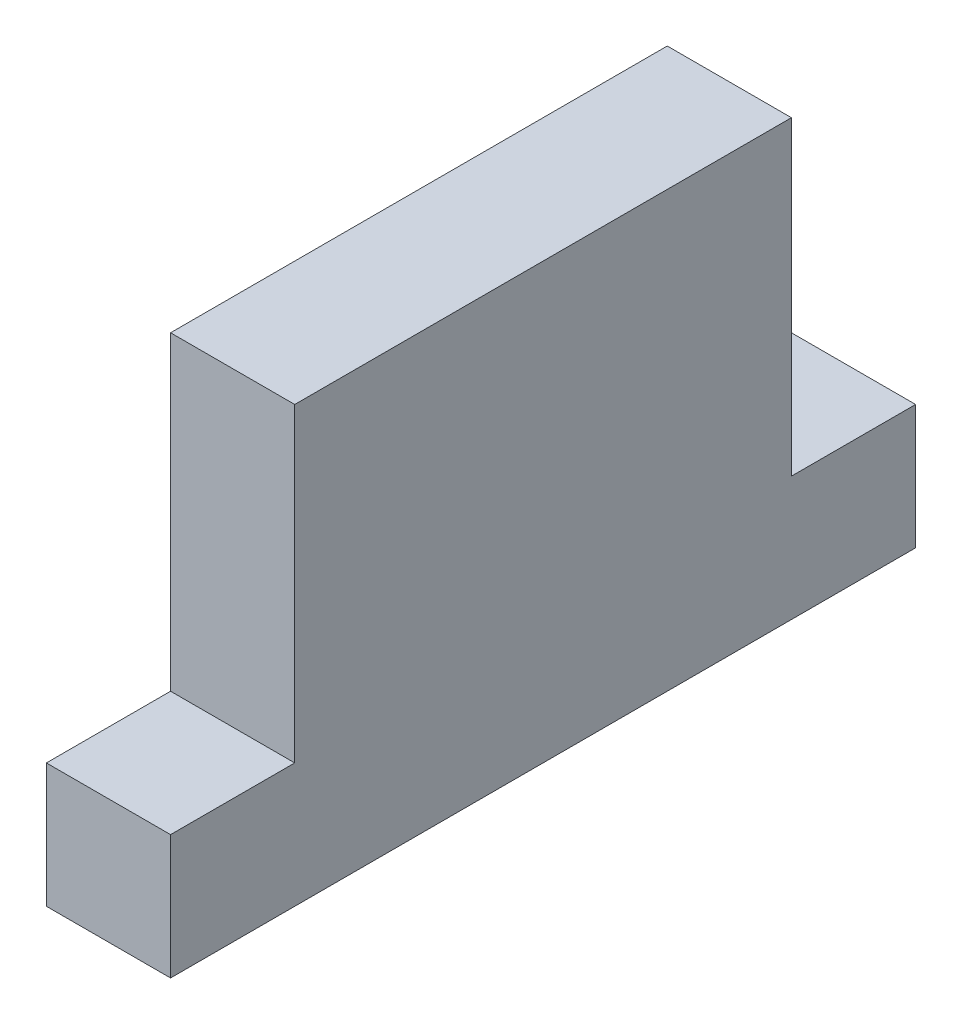
ISO-10303-21;
HEADER;
FILE_DESCRIPTION(('STEP AP214'),'2;1');
FILE_NAME('part.step','',(''),(''),'','','');
FILE_SCHEMA(('AUTOMOTIVE_DESIGN { 1 0 10303 214 1 1 1 1 }'));
ENDSEC;
DATA;
#1=APPLICATION_CONTEXT('core data for automotive mechanical design processes');
#2=APPLICATION_PROTOCOL_DEFINITION('international standard','automotive_design',2000,#1);
#3=PRODUCT_CONTEXT('',#1,'mechanical');
#4=PRODUCT('Part','Part','',(#3));
#5=PRODUCT_RELATED_PRODUCT_CATEGORY('part','',(#4));
#6=PRODUCT_DEFINITION_FORMATION('','',#4);
#7=PRODUCT_DEFINITION_CONTEXT('part definition',#1,'design');
#8=PRODUCT_DEFINITION('design','',#6,#7);
#9=PRODUCT_DEFINITION_SHAPE('','',#8);
#10=(LENGTH_UNIT() NAMED_UNIT(*) SI_UNIT(.MILLI.,.METRE.));
#11=(NAMED_UNIT(*) PLANE_ANGLE_UNIT() SI_UNIT($,.RADIAN.));
#12=(NAMED_UNIT(*) SI_UNIT($,.STERADIAN.) SOLID_ANGLE_UNIT());
#13=UNCERTAINTY_MEASURE_WITH_UNIT(LENGTH_MEASURE(1.E-05),#10,'distance_accuracy_value','');
#14=(GEOMETRIC_REPRESENTATION_CONTEXT(3) GLOBAL_UNCERTAINTY_ASSIGNED_CONTEXT((#13)) GLOBAL_UNIT_ASSIGNED_CONTEXT((#10,
#11,#12)) REPRESENTATION_CONTEXT('',''));
#15=CARTESIAN_POINT('',(0.,0.,0.));
#16=DIRECTION('',(0.,0.,1.));
#17=DIRECTION('',(1.,0.,0.));
#18=AXIS2_PLACEMENT_3D('',#15,#16,#17);
#19=CARTESIAN_POINT('',(0.,20.,0.));
#20=DIRECTION('',(0.,1.,0.));
#21=DIRECTION('',(0.,0.,1.));
#22=AXIS2_PLACEMENT_3D('',#19,#20,#21);
#23=PLANE('',#22);
#24=DIRECTION('',(0.,0.,1.));
#25=VECTOR('',#24,1.);
#26=CARTESIAN_POINT('',(-10.,20.,-60.));
#27=LINE('',#26,#25);
#28=CARTESIAN_POINT('',(-10.,20.,-60.));
#29=VERTEX_POINT('',#28);
#30=CARTESIAN_POINT('',(-10.,20.,-40.));
#31=VERTEX_POINT('',#30);
#32=EDGE_CURVE('E127',#29,#31,#27,.T.);
#33=ORIENTED_EDGE('',*,*,#32,.T.);
#34=DIRECTION('',(1.,0.,0.));
#35=VECTOR('',#34,1.);
#36=CARTESIAN_POINT('',(-10.,20.,-40.));
#37=LINE('',#36,#35);
#38=CARTESIAN_POINT('',(10.,20.,-40.));
#39=VERTEX_POINT('',#38);
#40=EDGE_CURVE('E113',#31,#39,#37,.T.);
#41=ORIENTED_EDGE('',*,*,#40,.T.);
#42=DIRECTION('',(0.,0.,-1.));
#43=VECTOR('',#42,1.);
#44=CARTESIAN_POINT('',(10.,20.,-60.));
#45=LINE('',#44,#43);
#46=CARTESIAN_POINT('',(10.,20.,-60.));
#47=VERTEX_POINT('',#46);
#48=EDGE_CURVE('E92',#39,#47,#45,.T.);
#49=ORIENTED_EDGE('',*,*,#48,.T.);
#50=DIRECTION('',(-1.,0.,0.));
#51=VECTOR('',#50,1.);
#52=CARTESIAN_POINT('',(-10.,20.,-60.));
#53=LINE('',#52,#51);
#54=EDGE_CURVE('E134',#47,#29,#53,.T.);
#55=ORIENTED_EDGE('',*,*,#54,.T.);
#56=EDGE_LOOP('',(#33,#41,#49,#55));
#57=FACE_BOUND('',#56,.T.);
#58=ADVANCED_FACE('F39',(#57),#23,.T.);
#59=CARTESIAN_POINT('',(10.,20.,-60.));
#60=DIRECTION('',(-1.,0.,0.));
#61=DIRECTION('',(0.,0.,1.));
#62=AXIS2_PLACEMENT_3D('',#59,#60,#61);
#63=PLANE('',#62);
#64=DIRECTION('',(0.,0.,-1.));
#65=VECTOR('',#64,1.);
#66=CARTESIAN_POINT('',(10.,0.,-60.));
#67=LINE('',#66,#65);
#68=CARTESIAN_POINT('',(10.,0.,60.));
#69=VERTEX_POINT('',#68);
#70=CARTESIAN_POINT('',(10.,0.,-60.));
#71=VERTEX_POINT('',#70);
#72=EDGE_CURVE('E146',#69,#71,#67,.T.);
#73=ORIENTED_EDGE('',*,*,#72,.T.);
#74=DIRECTION('',(0.,-1.,0.));
#75=VECTOR('',#74,1.);
#76=CARTESIAN_POINT('',(10.,20.,-60.));
#77=LINE('',#76,#75);
#78=EDGE_CURVE('E11',#47,#71,#77,.T.);
#79=ORIENTED_EDGE('',*,*,#78,.F.);
#80=ORIENTED_EDGE('',*,*,#48,.F.);
#81=DIRECTION('',(0.,1.,0.));
#82=VECTOR('',#81,1.);
#83=CARTESIAN_POINT('',(10.,70.,-40.));
#84=LINE('',#83,#82);
#85=CARTESIAN_POINT('',(10.,70.,-40.));
#86=VERTEX_POINT('',#85);
#87=EDGE_CURVE('E55',#39,#86,#84,.T.);
#88=ORIENTED_EDGE('',*,*,#87,.T.);
#89=DIRECTION('',(0.,0.,1.));
#90=VECTOR('',#89,1.);
#91=CARTESIAN_POINT('',(10.,70.,40.));
#92=LINE('',#91,#90);
#93=CARTESIAN_POINT('',(10.,70.,40.));
#94=VERTEX_POINT('',#93);
#95=EDGE_CURVE('E196',#86,#94,#92,.T.);
#96=ORIENTED_EDGE('',*,*,#95,.T.);
#97=DIRECTION('',(0.,-1.,0.));
#98=VECTOR('',#97,1.);
#99=CARTESIAN_POINT('',(10.,20.,40.));
#100=LINE('',#99,#98);
#101=CARTESIAN_POINT('',(10.,20.,40.));
#102=VERTEX_POINT('',#101);
#103=EDGE_CURVE('E132',#94,#102,#100,.T.);
#104=ORIENTED_EDGE('',*,*,#103,.T.);
#105=CARTESIAN_POINT('',(10.,20.,60.));
#106=VERTEX_POINT('',#105);
#107=EDGE_CURVE('E174',#106,#102,#45,.T.);
#108=ORIENTED_EDGE('',*,*,#107,.F.);
#109=DIRECTION('',(0.,-1.,0.));
#110=VECTOR('',#109,1.);
#111=CARTESIAN_POINT('',(10.,20.,60.));
#112=LINE('',#111,#110);
#113=EDGE_CURVE('E141',#106,#69,#112,.T.);
#114=ORIENTED_EDGE('',*,*,#113,.T.);
#115=EDGE_LOOP('',(#73,#79,#80,#88,#96,#104,#108,#114));
#116=FACE_BOUND('',#115,.T.);
#117=ADVANCED_FACE('F41',(#116),#63,.F.);
#118=CARTESIAN_POINT('',(-10.,20.,-60.));
#119=DIRECTION('',(0.,0.,1.));
#120=DIRECTION('',(1.,0.,0.));
#121=AXIS2_PLACEMENT_3D('',#118,#119,#120);
#122=PLANE('',#121);
#123=DIRECTION('',(-1.,0.,0.));
#124=VECTOR('',#123,1.);
#125=CARTESIAN_POINT('',(-10.,0.,-60.));
#126=LINE('',#125,#124);
#127=CARTESIAN_POINT('',(-10.,0.,-60.));
#128=VERTEX_POINT('',#127);
#129=EDGE_CURVE('E150',#71,#128,#126,.T.);
#130=ORIENTED_EDGE('',*,*,#129,.T.);
#131=DIRECTION('',(0.,-1.,0.));
#132=VECTOR('',#131,1.);
#133=CARTESIAN_POINT('',(-10.,20.,-60.));
#134=LINE('',#133,#132);
#135=EDGE_CURVE('E48',#29,#128,#134,.T.);
#136=ORIENTED_EDGE('',*,*,#135,.F.);
#137=ORIENTED_EDGE('',*,*,#54,.F.);
#138=ORIENTED_EDGE('',*,*,#78,.T.);
#139=EDGE_LOOP('',(#130,#136,#137,#138));
#140=FACE_BOUND('',#139,.T.);
#141=ADVANCED_FACE('F223',(#140),#122,.F.);
#142=CARTESIAN_POINT('',(-10.,20.,-60.));
#143=DIRECTION('',(1.,0.,0.));
#144=DIRECTION('',(0.,0.,-1.));
#145=AXIS2_PLACEMENT_3D('',#142,#143,#144);
#146=PLANE('',#145);
#147=DIRECTION('',(0.,0.,1.));
#148=VECTOR('',#147,1.);
#149=CARTESIAN_POINT('',(-10.,0.,-60.));
#150=LINE('',#149,#148);
#151=CARTESIAN_POINT('',(-9.99999999999999,0.,60.));
#152=VERTEX_POINT('',#151);
#153=EDGE_CURVE('E154',#128,#152,#150,.T.);
#154=ORIENTED_EDGE('',*,*,#153,.T.);
#155=DIRECTION('',(0.,-1.,0.));
#156=VECTOR('',#155,1.);
#157=CARTESIAN_POINT('',(-9.99999999999999,20.,60.));
#158=LINE('',#157,#156);
#159=CARTESIAN_POINT('',(-9.99999999999999,20.,60.));
#160=VERTEX_POINT('',#159);
#161=EDGE_CURVE('E161',#160,#152,#158,.T.);
#162=ORIENTED_EDGE('',*,*,#161,.F.);
#163=CARTESIAN_POINT('',(-9.99999999999999,20.,40.));
#164=VERTEX_POINT('',#163);
#165=EDGE_CURVE('E137',#164,#160,#27,.T.);
#166=ORIENTED_EDGE('',*,*,#165,.F.);
#167=DIRECTION('',(0.,-1.,0.));
#168=VECTOR('',#167,1.);
#169=CARTESIAN_POINT('',(-9.99999999999999,20.,40.));
#170=LINE('',#169,#168);
#171=CARTESIAN_POINT('',(-9.99999999999999,70.,40.));
#172=VERTEX_POINT('',#171);
#173=EDGE_CURVE('E120',#172,#164,#170,.T.);
#174=ORIENTED_EDGE('',*,*,#173,.F.);
#175=DIRECTION('',(0.,0.,1.));
#176=VECTOR('',#175,1.);
#177=CARTESIAN_POINT('',(-9.99999999999999,70.,40.));
#178=LINE('',#177,#176);
#179=CARTESIAN_POINT('',(-10.,70.,-40.));
#180=VERTEX_POINT('',#179);
#181=EDGE_CURVE('E130',#180,#172,#178,.T.);
#182=ORIENTED_EDGE('',*,*,#181,.F.);
#183=DIRECTION('',(0.,1.,0.));
#184=VECTOR('',#183,1.);
#185=CARTESIAN_POINT('',(-10.,70.,-40.));
#186=LINE('',#185,#184);
#187=EDGE_CURVE('E116',#31,#180,#186,.T.);
#188=ORIENTED_EDGE('',*,*,#187,.F.);
#189=ORIENTED_EDGE('',*,*,#32,.F.);
#190=ORIENTED_EDGE('',*,*,#135,.T.);
#191=EDGE_LOOP('',(#154,#162,#166,#174,#182,#188,#189,#190));
#192=FACE_BOUND('',#191,.T.);
#193=ADVANCED_FACE('F125',(#192),#146,.F.);
#194=CARTESIAN_POINT('',(-9.99999999999999,20.,60.));
#195=DIRECTION('',(0.,0.,-1.));
#196=DIRECTION('',(-1.,0.,0.));
#197=AXIS2_PLACEMENT_3D('',#194,#195,#196);
#198=PLANE('',#197);
#199=DIRECTION('',(1.,0.,0.));
#200=VECTOR('',#199,1.);
#201=CARTESIAN_POINT('',(-9.99999999999999,0.,60.));
#202=LINE('',#201,#200);
#203=EDGE_CURVE('E85',#152,#69,#202,.T.);
#204=ORIENTED_EDGE('',*,*,#203,.T.);
#205=ORIENTED_EDGE('',*,*,#113,.F.);
#206=DIRECTION('',(1.,0.,0.));
#207=VECTOR('',#206,1.);
#208=CARTESIAN_POINT('',(-9.99999999999999,20.,60.));
#209=LINE('',#208,#207);
#210=EDGE_CURVE('E64',#160,#106,#209,.T.);
#211=ORIENTED_EDGE('',*,*,#210,.F.);
#212=ORIENTED_EDGE('',*,*,#161,.T.);
#213=EDGE_LOOP('',(#204,#205,#211,#212));
#214=FACE_BOUND('',#213,.T.);
#215=ADVANCED_FACE('F175',(#214),#198,.F.);
#216=DIRECTION('',(1.,0.,0.));
#217=VECTOR('',#216,1.);
#218=CARTESIAN_POINT('',(-9.99999999999999,20.,40.));
#219=LINE('',#218,#217);
#220=EDGE_CURVE('E151',#164,#102,#219,.T.);
#221=ORIENTED_EDGE('',*,*,#220,.F.);
#222=ORIENTED_EDGE('',*,*,#165,.T.);
#223=ORIENTED_EDGE('',*,*,#210,.T.);
#224=ORIENTED_EDGE('',*,*,#107,.T.);
#225=EDGE_LOOP('',(#221,#222,#223,#224));
#226=FACE_BOUND('',#225,.T.);
#227=ADVANCED_FACE('F178',(#226),#23,.T.);
#228=CARTESIAN_POINT('',(0.,0.,0.));
#229=DIRECTION('',(0.,1.,0.));
#230=DIRECTION('',(0.,0.,1.));
#231=AXIS2_PLACEMENT_3D('',#228,#229,#230);
#232=PLANE('',#231);
#233=ORIENTED_EDGE('',*,*,#72,.F.);
#234=ORIENTED_EDGE('',*,*,#203,.F.);
#235=ORIENTED_EDGE('',*,*,#153,.F.);
#236=ORIENTED_EDGE('',*,*,#129,.F.);
#237=EDGE_LOOP('',(#233,#234,#235,#236));
#238=FACE_BOUND('',#237,.T.);
#239=ADVANCED_FACE('F169',(#238),#232,.F.);
#240=CARTESIAN_POINT('',(-9.99999999999999,20.,40.));
#241=DIRECTION('',(0.,0.,1.));
#242=DIRECTION('',(1.,0.,0.));
#243=AXIS2_PLACEMENT_3D('',#240,#241,#242);
#244=PLANE('',#243);
#245=ORIENTED_EDGE('',*,*,#103,.F.);
#246=DIRECTION('',(1.,0.,0.));
#247=VECTOR('',#246,1.);
#248=CARTESIAN_POINT('',(-9.99999999999999,70.,40.));
#249=LINE('',#248,#247);
#250=EDGE_CURVE('E182',#172,#94,#249,.T.);
#251=ORIENTED_EDGE('',*,*,#250,.F.);
#252=ORIENTED_EDGE('',*,*,#173,.T.);
#253=ORIENTED_EDGE('',*,*,#220,.T.);
#254=EDGE_LOOP('',(#245,#251,#252,#253));
#255=FACE_BOUND('',#254,.T.);
#256=ADVANCED_FACE('F206',(#255),#244,.T.);
#257=CARTESIAN_POINT('',(-9.99999999999999,70.,40.));
#258=DIRECTION('',(0.,1.,0.));
#259=DIRECTION('',(0.,0.,1.));
#260=AXIS2_PLACEMENT_3D('',#257,#258,#259);
#261=PLANE('',#260);
#262=ORIENTED_EDGE('',*,*,#95,.F.);
#263=DIRECTION('',(1.,0.,0.));
#264=VECTOR('',#263,1.);
#265=CARTESIAN_POINT('',(-10.,70.,-40.));
#266=LINE('',#265,#264);
#267=EDGE_CURVE('E119',#180,#86,#266,.T.);
#268=ORIENTED_EDGE('',*,*,#267,.F.);
#269=ORIENTED_EDGE('',*,*,#181,.T.);
#270=ORIENTED_EDGE('',*,*,#250,.T.);
#271=EDGE_LOOP('',(#262,#268,#269,#270));
#272=FACE_BOUND('',#271,.T.);
#273=ADVANCED_FACE('F197',(#272),#261,.T.);
#274=CARTESIAN_POINT('',(-10.,70.,-40.));
#275=DIRECTION('',(0.,0.,-1.));
#276=DIRECTION('',(-1.,0.,0.));
#277=AXIS2_PLACEMENT_3D('',#274,#275,#276);
#278=PLANE('',#277);
#279=ORIENTED_EDGE('',*,*,#87,.F.);
#280=ORIENTED_EDGE('',*,*,#40,.F.);
#281=ORIENTED_EDGE('',*,*,#187,.T.);
#282=ORIENTED_EDGE('',*,*,#267,.T.);
#283=EDGE_LOOP('',(#279,#280,#281,#282));
#284=FACE_BOUND('',#283,.T.);
#285=ADVANCED_FACE('F115',(#284),#278,.T.);
#286=CLOSED_SHELL('',(#58,#117,#141,#193,#215,#227,#239,#256,#273,#285));
#287=MANIFOLD_SOLID_BREP('B2',#286);
#288=ADVANCED_BREP_SHAPE_REPRESENTATION('',(#18,#287),#14);
#289=SHAPE_DEFINITION_REPRESENTATION(#9,#288);
ENDSEC;
END-ISO-10303-21;
